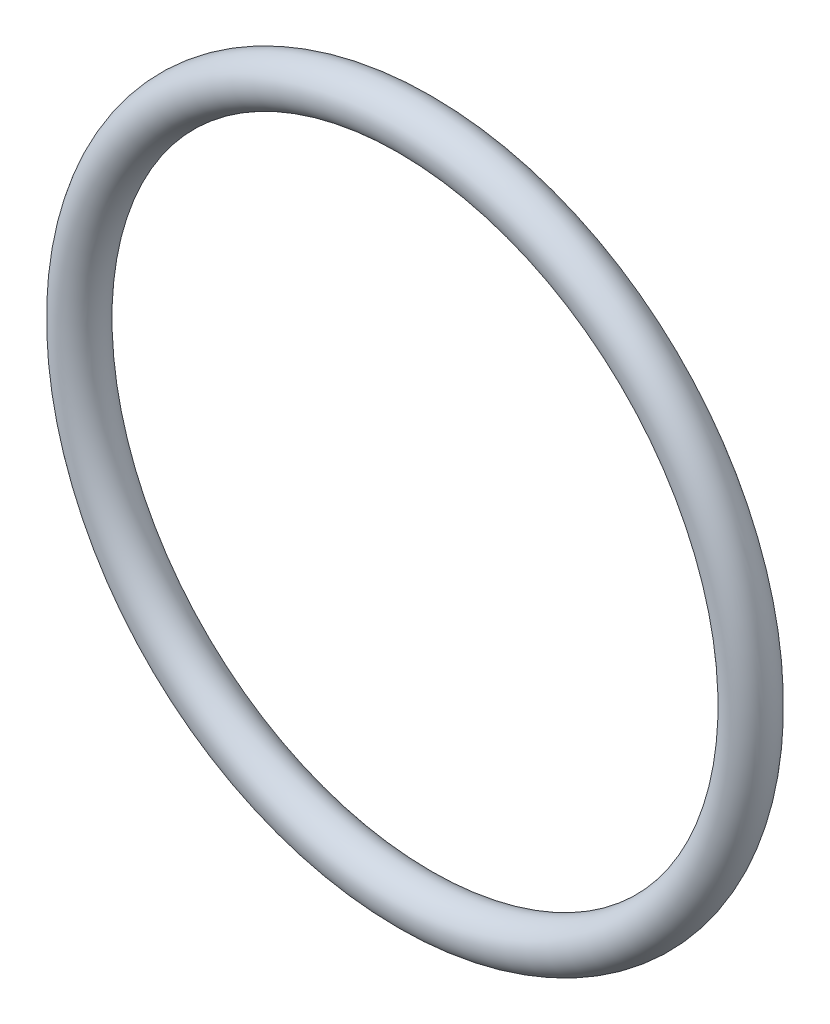
ISO-10303-21;
HEADER;
FILE_DESCRIPTION(('STEP AP214'),'2;1');
FILE_NAME('part.step','',(''),(''),'','','');
FILE_SCHEMA(('AUTOMOTIVE_DESIGN { 1 0 10303 214 1 1 1 1 }'));
ENDSEC;
DATA;
#1=APPLICATION_CONTEXT('core data for automotive mechanical design processes');
#2=APPLICATION_PROTOCOL_DEFINITION('international standard','automotive_design',2000,#1);
#3=PRODUCT_CONTEXT('',#1,'mechanical');
#4=PRODUCT('Part','Part','',(#3));
#5=PRODUCT_RELATED_PRODUCT_CATEGORY('part','',(#4));
#6=PRODUCT_DEFINITION_FORMATION('','',#4);
#7=PRODUCT_DEFINITION_CONTEXT('part definition',#1,'design');
#8=PRODUCT_DEFINITION('design','',#6,#7);
#9=PRODUCT_DEFINITION_SHAPE('','',#8);
#10=(LENGTH_UNIT() NAMED_UNIT(*) SI_UNIT(.MILLI.,.METRE.));
#11=(NAMED_UNIT(*) PLANE_ANGLE_UNIT() SI_UNIT($,.RADIAN.));
#12=(NAMED_UNIT(*) SI_UNIT($,.STERADIAN.) SOLID_ANGLE_UNIT());
#13=UNCERTAINTY_MEASURE_WITH_UNIT(LENGTH_MEASURE(1.E-05),#10,'distance_accuracy_value','');
#14=(GEOMETRIC_REPRESENTATION_CONTEXT(3) GLOBAL_UNCERTAINTY_ASSIGNED_CONTEXT((#13)) GLOBAL_UNIT_ASSIGNED_CONTEXT((#10,
#11,#12)) REPRESENTATION_CONTEXT('',''));
#15=CARTESIAN_POINT('',(0.,0.,0.));
#16=DIRECTION('',(0.,0.,1.));
#17=DIRECTION('',(1.,0.,0.));
#18=AXIS2_PLACEMENT_3D('',#15,#16,#17);
#19=CARTESIAN_POINT('',(0.,0.,0.));
#20=DIRECTION('',(0.,0.,1.));
#21=DIRECTION('',(1.,0.,0.));
#22=AXIS2_PLACEMENT_3D('',#19,#20,#21);
#23=TOROIDAL_SURFACE('',#22,29.,2.);
#24=CARTESIAN_POINT('',(0.,29.,0.));
#25=DIRECTION('',(1.,0.,0.));
#26=DIRECTION('',(0.,0.,-1.));
#27=AXIS2_PLACEMENT_3D('',#24,#25,#26);
#28=CIRCLE('',#27,2.);
#29=CARTESIAN_POINT('',(0.,31.,0.));
#30=VERTEX_POINT('',#29);
#31=EDGE_CURVE('E10',#30,#30,#28,.T.);
#32=CARTESIAN_POINT('',(0.,0.,0.));
#33=DIRECTION('',(0.,0.,1.));
#34=DIRECTION('',(1.,0.,0.));
#35=AXIS2_PLACEMENT_3D('',#32,#33,#34);
#36=CIRCLE('',#35,31.);
#37=EDGE_CURVE('',#30,#30,#36,.T.);
#38=ORIENTED_EDGE('',*,*,#31,.F.);
#39=ORIENTED_EDGE('',*,*,#31,.T.);
#40=ORIENTED_EDGE('',*,*,#37,.T.);
#41=ORIENTED_EDGE('',*,*,#37,.F.);
#42=EDGE_LOOP('',(#38,#40,#39,#41));
#43=FACE_BOUND('',#42,.T.);
#44=ADVANCED_FACE('F35',(#43),#23,.T.);
#45=CLOSED_SHELL('',(#44));
#46=MANIFOLD_SOLID_BREP('B2',#45);
#47=ADVANCED_BREP_SHAPE_REPRESENTATION('',(#18,#46),#14);
#48=SHAPE_DEFINITION_REPRESENTATION(#9,#47);
ENDSEC;
END-ISO-10303-21;
